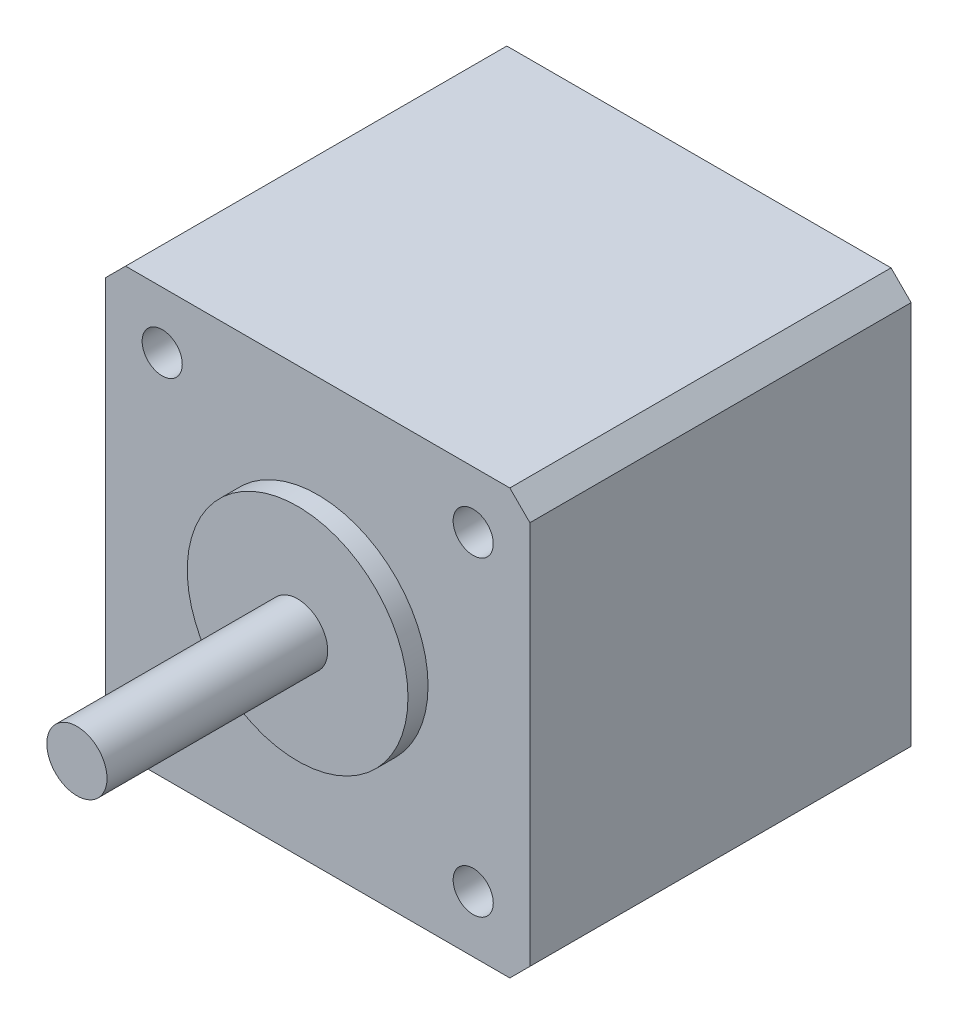
ISO-10303-21;
HEADER;
FILE_DESCRIPTION(('STEP AP214'),'2;1');
FILE_NAME('part.step','',(''),(''),'','','');
FILE_SCHEMA(('AUTOMOTIVE_DESIGN { 1 0 10303 214 1 1 1 1 }'));
ENDSEC;
DATA;
#1=APPLICATION_CONTEXT('core data for automotive mechanical design processes');
#2=APPLICATION_PROTOCOL_DEFINITION('international standard','automotive_design',2000,#1);
#3=PRODUCT_CONTEXT('',#1,'mechanical');
#4=PRODUCT('Part','Part','',(#3));
#5=PRODUCT_RELATED_PRODUCT_CATEGORY('part','',(#4));
#6=PRODUCT_DEFINITION_FORMATION('','',#4);
#7=PRODUCT_DEFINITION_CONTEXT('part definition',#1,'design');
#8=PRODUCT_DEFINITION('design','',#6,#7);
#9=PRODUCT_DEFINITION_SHAPE('','',#8);
#10=(LENGTH_UNIT() NAMED_UNIT(*) SI_UNIT(.MILLI.,.METRE.));
#11=(NAMED_UNIT(*) PLANE_ANGLE_UNIT() SI_UNIT($,.RADIAN.));
#12=(NAMED_UNIT(*) SI_UNIT($,.STERADIAN.) SOLID_ANGLE_UNIT());
#13=UNCERTAINTY_MEASURE_WITH_UNIT(LENGTH_MEASURE(1.E-05),#10,'distance_accuracy_value','');
#14=(GEOMETRIC_REPRESENTATION_CONTEXT(3) GLOBAL_UNCERTAINTY_ASSIGNED_CONTEXT((#13)) GLOBAL_UNIT_ASSIGNED_CONTEXT((#10,
#11,#12)) REPRESENTATION_CONTEXT('',''));
#15=CARTESIAN_POINT('',(0.,0.,0.));
#16=DIRECTION('',(0.,0.,1.));
#17=DIRECTION('',(1.,0.,0.));
#18=AXIS2_PLACEMENT_3D('',#15,#16,#17);
#19=CARTESIAN_POINT('',(0.,0.,38.));
#20=DIRECTION('',(0.,0.,1.));
#21=DIRECTION('',(1.,0.,0.));
#22=AXIS2_PLACEMENT_3D('',#19,#20,#21);
#23=PLANE('',#22);
#24=CARTESIAN_POINT('',(0.,0.,38.));
#25=DIRECTION('',(0.,0.,1.));
#26=DIRECTION('',(1.,0.,0.));
#27=AXIS2_PLACEMENT_3D('',#24,#25,#26);
#28=CIRCLE('',#27,11.);
#29=CARTESIAN_POINT('',(11.,0.,38.));
#30=VERTEX_POINT('',#29);
#31=EDGE_CURVE('E203',#30,#30,#28,.T.);
#32=ORIENTED_EDGE('',*,*,#31,.F.);
#33=EDGE_LOOP('',(#32));
#34=FACE_BOUND('',#33,.T.);
#35=CARTESIAN_POINT('',(15.5,-15.5,38.));
#36=DIRECTION('',(0.,0.,1.));
#37=DIRECTION('',(1.,0.,0.));
#38=AXIS2_PLACEMENT_3D('',#35,#36,#37);
#39=CIRCLE('',#38,2.);
#40=CARTESIAN_POINT('',(17.5,-15.5,38.));
#41=VERTEX_POINT('',#40);
#42=EDGE_CURVE('E188',#41,#41,#39,.T.);
#43=ORIENTED_EDGE('',*,*,#42,.F.);
#44=EDGE_LOOP('',(#43));
#45=FACE_BOUND('',#44,.T.);
#46=CARTESIAN_POINT('',(-15.5,15.5,38.));
#47=DIRECTION('',(0.,0.,1.));
#48=DIRECTION('',(1.,0.,0.));
#49=AXIS2_PLACEMENT_3D('',#46,#47,#48);
#50=CIRCLE('',#49,2.);
#51=CARTESIAN_POINT('',(-13.5,15.5,38.));
#52=VERTEX_POINT('',#51);
#53=EDGE_CURVE('E134',#52,#52,#50,.T.);
#54=ORIENTED_EDGE('',*,*,#53,.F.);
#55=EDGE_LOOP('',(#54));
#56=FACE_BOUND('',#55,.T.);
#57=DIRECTION('',(-0.707106781186548,-0.707106781186547,0.));
#58=VECTOR('',#57,1.);
#59=CARTESIAN_POINT('',(-21.15,19.15,38.));
#60=LINE('',#59,#58);
#61=CARTESIAN_POINT('',(-19.15,21.15,38.));
#62=VERTEX_POINT('',#61);
#63=CARTESIAN_POINT('',(-21.15,19.15,38.));
#64=VERTEX_POINT('',#63);
#65=EDGE_CURVE('E145',#62,#64,#60,.T.);
#66=ORIENTED_EDGE('',*,*,#65,.T.);
#67=DIRECTION('',(0.,-1.,0.));
#68=VECTOR('',#67,1.);
#69=CARTESIAN_POINT('',(-21.15,-19.15,38.));
#70=LINE('',#69,#68);
#71=CARTESIAN_POINT('',(-21.15,-19.15,38.));
#72=VERTEX_POINT('',#71);
#73=EDGE_CURVE('E93',#64,#72,#70,.T.);
#74=ORIENTED_EDGE('',*,*,#73,.T.);
#75=DIRECTION('',(0.707106781186548,-0.707106781186547,0.));
#76=VECTOR('',#75,1.);
#77=CARTESIAN_POINT('',(-19.15,-21.15,38.));
#78=LINE('',#77,#76);
#79=CARTESIAN_POINT('',(-19.15,-21.15,38.));
#80=VERTEX_POINT('',#79);
#81=EDGE_CURVE('E160',#72,#80,#78,.T.);
#82=ORIENTED_EDGE('',*,*,#81,.T.);
#83=DIRECTION('',(1.,0.,0.));
#84=VECTOR('',#83,1.);
#85=CARTESIAN_POINT('',(-19.15,-21.15,38.));
#86=LINE('',#85,#84);
#87=CARTESIAN_POINT('',(19.15,-21.15,38.));
#88=VERTEX_POINT('',#87);
#89=EDGE_CURVE('E173',#80,#88,#86,.T.);
#90=ORIENTED_EDGE('',*,*,#89,.T.);
#91=DIRECTION('',(0.707106781186548,0.707106781186547,0.));
#92=VECTOR('',#91,1.);
#93=CARTESIAN_POINT('',(19.15,-21.15,38.));
#94=LINE('',#93,#92);
#95=CARTESIAN_POINT('',(21.15,-19.15,38.));
#96=VERTEX_POINT('',#95);
#97=EDGE_CURVE('E112',#88,#96,#94,.T.);
#98=ORIENTED_EDGE('',*,*,#97,.T.);
#99=DIRECTION('',(0.,1.,0.));
#100=VECTOR('',#99,1.);
#101=CARTESIAN_POINT('',(21.15,-19.15,38.));
#102=LINE('',#101,#100);
#103=CARTESIAN_POINT('',(21.15,19.15,38.));
#104=VERTEX_POINT('',#103);
#105=EDGE_CURVE('E106',#96,#104,#102,.T.);
#106=ORIENTED_EDGE('',*,*,#105,.T.);
#107=DIRECTION('',(-0.707106781186548,0.707106781186547,0.));
#108=VECTOR('',#107,1.);
#109=CARTESIAN_POINT('',(21.15,19.15,38.));
#110=LINE('',#109,#108);
#111=CARTESIAN_POINT('',(19.15,21.15,38.));
#112=VERTEX_POINT('',#111);
#113=EDGE_CURVE('E110',#104,#112,#110,.T.);
#114=ORIENTED_EDGE('',*,*,#113,.T.);
#115=DIRECTION('',(-1.,0.,0.));
#116=VECTOR('',#115,1.);
#117=CARTESIAN_POINT('',(-19.15,21.15,38.));
#118=LINE('',#117,#116);
#119=EDGE_CURVE('E50',#112,#62,#118,.T.);
#120=ORIENTED_EDGE('',*,*,#119,.T.);
#121=EDGE_LOOP('',(#66,#74,#82,#90,#98,#106,#114,#120));
#122=FACE_BOUND('',#121,.T.);
#123=CARTESIAN_POINT('',(15.5,15.5,38.));
#124=DIRECTION('',(0.,0.,1.));
#125=DIRECTION('',(-1.,0.,0.));
#126=AXIS2_PLACEMENT_3D('',#123,#124,#125);
#127=CIRCLE('',#126,2.);
#128=CARTESIAN_POINT('',(13.5,15.5,38.));
#129=VERTEX_POINT('',#128);
#130=EDGE_CURVE('E182',#129,#129,#127,.T.);
#131=ORIENTED_EDGE('',*,*,#130,.F.);
#132=EDGE_LOOP('',(#131));
#133=FACE_BOUND('',#132,.T.);
#134=CARTESIAN_POINT('',(-15.5,-15.5,38.));
#135=DIRECTION('',(0.,0.,1.));
#136=DIRECTION('',(-1.,0.,0.));
#137=AXIS2_PLACEMENT_3D('',#134,#135,#136);
#138=CIRCLE('',#137,2.);
#139=CARTESIAN_POINT('',(-17.5,-15.5,38.));
#140=VERTEX_POINT('',#139);
#141=EDGE_CURVE('E194',#140,#140,#138,.T.);
#142=ORIENTED_EDGE('',*,*,#141,.F.);
#143=EDGE_LOOP('',(#142));
#144=FACE_BOUND('',#143,.T.);
#145=ADVANCED_FACE('F33',(#34,#45,#56,#122,#133,#144),#23,.T.);
#146=CARTESIAN_POINT('',(0.,0.,0.));
#147=DIRECTION('',(0.,0.,1.));
#148=DIRECTION('',(1.,0.,0.));
#149=AXIS2_PLACEMENT_3D('',#146,#147,#148);
#150=PLANE('',#149);
#151=DIRECTION('',(-0.707106781186548,-0.707106781186547,0.));
#152=VECTOR('',#151,1.);
#153=CARTESIAN_POINT('',(-21.15,19.15,0.));
#154=LINE('',#153,#152);
#155=CARTESIAN_POINT('',(-19.15,21.15,0.));
#156=VERTEX_POINT('',#155);
#157=CARTESIAN_POINT('',(-21.15,19.15,0.));
#158=VERTEX_POINT('',#157);
#159=EDGE_CURVE('E130',#156,#158,#154,.T.);
#160=ORIENTED_EDGE('',*,*,#159,.F.);
#161=DIRECTION('',(-1.,0.,0.));
#162=VECTOR('',#161,1.);
#163=CARTESIAN_POINT('',(-19.15,21.15,0.));
#164=LINE('',#163,#162);
#165=CARTESIAN_POINT('',(19.15,21.15,0.));
#166=VERTEX_POINT('',#165);
#167=EDGE_CURVE('E85',#166,#156,#164,.T.);
#168=ORIENTED_EDGE('',*,*,#167,.F.);
#169=DIRECTION('',(-0.707106781186548,0.707106781186547,0.));
#170=VECTOR('',#169,1.);
#171=CARTESIAN_POINT('',(21.15,19.15,0.));
#172=LINE('',#171,#170);
#173=CARTESIAN_POINT('',(21.15,19.15,0.));
#174=VERTEX_POINT('',#173);
#175=EDGE_CURVE('E79',#174,#166,#172,.T.);
#176=ORIENTED_EDGE('',*,*,#175,.F.);
#177=DIRECTION('',(0.,1.,0.));
#178=VECTOR('',#177,1.);
#179=CARTESIAN_POINT('',(21.15,-19.15,0.));
#180=LINE('',#179,#178);
#181=CARTESIAN_POINT('',(21.15,-19.15,0.));
#182=VERTEX_POINT('',#181);
#183=EDGE_CURVE('E120',#182,#174,#180,.T.);
#184=ORIENTED_EDGE('',*,*,#183,.F.);
#185=DIRECTION('',(0.707106781186548,0.707106781186547,0.));
#186=VECTOR('',#185,1.);
#187=CARTESIAN_POINT('',(19.15,-21.15,0.));
#188=LINE('',#187,#186);
#189=CARTESIAN_POINT('',(19.15,-21.15,0.));
#190=VERTEX_POINT('',#189);
#191=EDGE_CURVE('E140',#190,#182,#188,.T.);
#192=ORIENTED_EDGE('',*,*,#191,.F.);
#193=DIRECTION('',(1.,0.,0.));
#194=VECTOR('',#193,1.);
#195=CARTESIAN_POINT('',(-19.15,-21.15,0.));
#196=LINE('',#195,#194);
#197=CARTESIAN_POINT('',(-19.15,-21.15,0.));
#198=VERTEX_POINT('',#197);
#199=EDGE_CURVE('E138',#198,#190,#196,.T.);
#200=ORIENTED_EDGE('',*,*,#199,.F.);
#201=DIRECTION('',(0.707106781186548,-0.707106781186547,0.));
#202=VECTOR('',#201,1.);
#203=CARTESIAN_POINT('',(-19.15,-21.15,0.));
#204=LINE('',#203,#202);
#205=CARTESIAN_POINT('',(-21.15,-19.15,0.));
#206=VERTEX_POINT('',#205);
#207=EDGE_CURVE('E136',#206,#198,#204,.T.);
#208=ORIENTED_EDGE('',*,*,#207,.F.);
#209=DIRECTION('',(0.,-1.,0.));
#210=VECTOR('',#209,1.);
#211=CARTESIAN_POINT('',(-21.15,-19.15,0.));
#212=LINE('',#211,#210);
#213=EDGE_CURVE('E133',#158,#206,#212,.T.);
#214=ORIENTED_EDGE('',*,*,#213,.F.);
#215=EDGE_LOOP('',(#160,#168,#176,#184,#192,#200,#208,#214));
#216=FACE_BOUND('',#215,.T.);
#217=CARTESIAN_POINT('',(-15.5,15.5,0.));
#218=DIRECTION('',(0.,0.,1.));
#219=DIRECTION('',(1.,0.,0.));
#220=AXIS2_PLACEMENT_3D('',#217,#218,#219);
#221=CIRCLE('',#220,2.);
#222=CARTESIAN_POINT('',(-13.5,15.5,0.));
#223=VERTEX_POINT('',#222);
#224=EDGE_CURVE('E179',#223,#223,#221,.T.);
#225=ORIENTED_EDGE('',*,*,#224,.T.);
#226=EDGE_LOOP('',(#225));
#227=FACE_BOUND('',#226,.T.);
#228=CARTESIAN_POINT('',(15.5,15.5,0.));
#229=DIRECTION('',(0.,0.,1.));
#230=DIRECTION('',(-1.,0.,0.));
#231=AXIS2_PLACEMENT_3D('',#228,#229,#230);
#232=CIRCLE('',#231,2.);
#233=CARTESIAN_POINT('',(13.5,15.5,0.));
#234=VERTEX_POINT('',#233);
#235=EDGE_CURVE('E185',#234,#234,#232,.T.);
#236=ORIENTED_EDGE('',*,*,#235,.T.);
#237=EDGE_LOOP('',(#236));
#238=FACE_BOUND('',#237,.T.);
#239=CARTESIAN_POINT('',(15.5,-15.5,0.));
#240=DIRECTION('',(0.,0.,1.));
#241=DIRECTION('',(1.,0.,0.));
#242=AXIS2_PLACEMENT_3D('',#239,#240,#241);
#243=CIRCLE('',#242,2.);
#244=CARTESIAN_POINT('',(17.5,-15.5,0.));
#245=VERTEX_POINT('',#244);
#246=EDGE_CURVE('E191',#245,#245,#243,.T.);
#247=ORIENTED_EDGE('',*,*,#246,.T.);
#248=EDGE_LOOP('',(#247));
#249=FACE_BOUND('',#248,.T.);
#250=CARTESIAN_POINT('',(-15.5,-15.5,0.));
#251=DIRECTION('',(0.,0.,1.));
#252=DIRECTION('',(-1.,0.,0.));
#253=AXIS2_PLACEMENT_3D('',#250,#251,#252);
#254=CIRCLE('',#253,2.);
#255=CARTESIAN_POINT('',(-17.5,-15.5,0.));
#256=VERTEX_POINT('',#255);
#257=EDGE_CURVE('E197',#256,#256,#254,.T.);
#258=ORIENTED_EDGE('',*,*,#257,.T.);
#259=EDGE_LOOP('',(#258));
#260=FACE_BOUND('',#259,.T.);
#261=ADVANCED_FACE('F164',(#216,#227,#238,#249,#260),#150,.F.);
#262=CARTESIAN_POINT('',(-21.15,19.15,38.));
#263=DIRECTION('',(0.707106781186547,-0.707106781186548,0.));
#264=DIRECTION('',(0.707106781186548,0.707106781186547,0.));
#265=AXIS2_PLACEMENT_3D('',#262,#263,#264);
#266=PLANE('',#265);
#267=ORIENTED_EDGE('',*,*,#159,.T.);
#268=DIRECTION('',(0.,0.,-1.));
#269=VECTOR('',#268,1.);
#270=CARTESIAN_POINT('',(-21.15,19.15,38.));
#271=LINE('',#270,#269);
#272=EDGE_CURVE('E11',#64,#158,#271,.T.);
#273=ORIENTED_EDGE('',*,*,#272,.F.);
#274=ORIENTED_EDGE('',*,*,#65,.F.);
#275=DIRECTION('',(0.,0.,-1.));
#276=VECTOR('',#275,1.);
#277=CARTESIAN_POINT('',(-19.15,21.15,38.));
#278=LINE('',#277,#276);
#279=EDGE_CURVE('E126',#62,#156,#278,.T.);
#280=ORIENTED_EDGE('',*,*,#279,.T.);
#281=EDGE_LOOP('',(#267,#273,#274,#280));
#282=FACE_BOUND('',#281,.T.);
#283=ADVANCED_FACE('F35',(#282),#266,.F.);
#284=CARTESIAN_POINT('',(-21.15,-19.15,38.));
#285=DIRECTION('',(1.,0.,0.));
#286=DIRECTION('',(0.,0.,-1.));
#287=AXIS2_PLACEMENT_3D('',#284,#285,#286);
#288=PLANE('',#287);
#289=ORIENTED_EDGE('',*,*,#213,.T.);
#290=DIRECTION('',(0.,0.,-1.));
#291=VECTOR('',#290,1.);
#292=CARTESIAN_POINT('',(-21.15,-19.15,38.));
#293=LINE('',#292,#291);
#294=EDGE_CURVE('E42',#72,#206,#293,.T.);
#295=ORIENTED_EDGE('',*,*,#294,.F.);
#296=ORIENTED_EDGE('',*,*,#73,.F.);
#297=ORIENTED_EDGE('',*,*,#272,.T.);
#298=EDGE_LOOP('',(#289,#295,#296,#297));
#299=FACE_BOUND('',#298,.T.);
#300=ADVANCED_FACE('F283',(#299),#288,.F.);
#301=CARTESIAN_POINT('',(-19.15,-21.15,38.));
#302=DIRECTION('',(0.707106781186547,0.707106781186548,0.));
#303=DIRECTION('',(-0.707106781186548,0.707106781186547,0.));
#304=AXIS2_PLACEMENT_3D('',#301,#302,#303);
#305=PLANE('',#304);
#306=ORIENTED_EDGE('',*,*,#207,.T.);
#307=DIRECTION('',(0.,0.,-1.));
#308=VECTOR('',#307,1.);
#309=CARTESIAN_POINT('',(-19.15,-21.15,38.));
#310=LINE('',#309,#308);
#311=EDGE_CURVE('E152',#80,#198,#310,.T.);
#312=ORIENTED_EDGE('',*,*,#311,.F.);
#313=ORIENTED_EDGE('',*,*,#81,.F.);
#314=ORIENTED_EDGE('',*,*,#294,.T.);
#315=EDGE_LOOP('',(#306,#312,#313,#314));
#316=FACE_BOUND('',#315,.T.);
#317=ADVANCED_FACE('F158',(#316),#305,.F.);
#318=CARTESIAN_POINT('',(-19.15,-21.15,38.));
#319=DIRECTION('',(0.,1.,0.));
#320=DIRECTION('',(0.,0.,1.));
#321=AXIS2_PLACEMENT_3D('',#318,#319,#320);
#322=PLANE('',#321);
#323=ORIENTED_EDGE('',*,*,#199,.T.);
#324=DIRECTION('',(0.,0.,-1.));
#325=VECTOR('',#324,1.);
#326=CARTESIAN_POINT('',(19.15,-21.15,38.));
#327=LINE('',#326,#325);
#328=EDGE_CURVE('E149',#88,#190,#327,.T.);
#329=ORIENTED_EDGE('',*,*,#328,.F.);
#330=ORIENTED_EDGE('',*,*,#89,.F.);
#331=ORIENTED_EDGE('',*,*,#311,.T.);
#332=EDGE_LOOP('',(#323,#329,#330,#331));
#333=FACE_BOUND('',#332,.T.);
#334=ADVANCED_FACE('F169',(#333),#322,.F.);
#335=CARTESIAN_POINT('',(19.15,-21.15,38.));
#336=DIRECTION('',(-0.707106781186547,0.707106781186548,0.));
#337=DIRECTION('',(-0.707106781186548,-0.707106781186547,0.));
#338=AXIS2_PLACEMENT_3D('',#335,#336,#337);
#339=PLANE('',#338);
#340=ORIENTED_EDGE('',*,*,#191,.T.);
#341=DIRECTION('',(0.,0.,-1.));
#342=VECTOR('',#341,1.);
#343=CARTESIAN_POINT('',(21.15,-19.15,38.));
#344=LINE('',#343,#342);
#345=EDGE_CURVE('E121',#96,#182,#344,.T.);
#346=ORIENTED_EDGE('',*,*,#345,.F.);
#347=ORIENTED_EDGE('',*,*,#97,.F.);
#348=ORIENTED_EDGE('',*,*,#328,.T.);
#349=EDGE_LOOP('',(#340,#346,#347,#348));
#350=FACE_BOUND('',#349,.T.);
#351=ADVANCED_FACE('F172',(#350),#339,.F.);
#352=CARTESIAN_POINT('',(21.15,-19.15,38.));
#353=DIRECTION('',(-1.,0.,0.));
#354=DIRECTION('',(0.,0.,1.));
#355=AXIS2_PLACEMENT_3D('',#352,#353,#354);
#356=PLANE('',#355);
#357=ORIENTED_EDGE('',*,*,#183,.T.);
#358=DIRECTION('',(0.,0.,-1.));
#359=VECTOR('',#358,1.);
#360=CARTESIAN_POINT('',(21.15,19.15,38.));
#361=LINE('',#360,#359);
#362=EDGE_CURVE('E117',#104,#174,#361,.T.);
#363=ORIENTED_EDGE('',*,*,#362,.F.);
#364=ORIENTED_EDGE('',*,*,#105,.F.);
#365=ORIENTED_EDGE('',*,*,#345,.T.);
#366=EDGE_LOOP('',(#357,#363,#364,#365));
#367=FACE_BOUND('',#366,.T.);
#368=ADVANCED_FACE('F118',(#367),#356,.F.);
#369=CARTESIAN_POINT('',(21.15,19.15,38.));
#370=DIRECTION('',(-0.707106781186547,-0.707106781186548,0.));
#371=DIRECTION('',(0.707106781186548,-0.707106781186547,0.));
#372=AXIS2_PLACEMENT_3D('',#369,#370,#371);
#373=PLANE('',#372);
#374=ORIENTED_EDGE('',*,*,#175,.T.);
#375=DIRECTION('',(0.,0.,-1.));
#376=VECTOR('',#375,1.);
#377=CARTESIAN_POINT('',(19.15,21.15,38.));
#378=LINE('',#377,#376);
#379=EDGE_CURVE('E122',#112,#166,#378,.T.);
#380=ORIENTED_EDGE('',*,*,#379,.F.);
#381=ORIENTED_EDGE('',*,*,#113,.F.);
#382=ORIENTED_EDGE('',*,*,#362,.T.);
#383=EDGE_LOOP('',(#374,#380,#381,#382));
#384=FACE_BOUND('',#383,.T.);
#385=ADVANCED_FACE('F124',(#384),#373,.F.);
#386=CARTESIAN_POINT('',(-19.15,21.15,38.));
#387=DIRECTION('',(0.,-1.,0.));
#388=DIRECTION('',(0.,0.,-1.));
#389=AXIS2_PLACEMENT_3D('',#386,#387,#388);
#390=PLANE('',#389);
#391=ORIENTED_EDGE('',*,*,#167,.T.);
#392=ORIENTED_EDGE('',*,*,#279,.F.);
#393=ORIENTED_EDGE('',*,*,#119,.F.);
#394=ORIENTED_EDGE('',*,*,#379,.T.);
#395=EDGE_LOOP('',(#391,#392,#393,#394));
#396=FACE_BOUND('',#395,.T.);
#397=ADVANCED_FACE('F247',(#396),#390,.F.);
#398=CARTESIAN_POINT('',(-15.5,15.5,38.));
#399=DIRECTION('',(0.,0.,-1.));
#400=DIRECTION('',(-1.,0.,0.));
#401=AXIS2_PLACEMENT_3D('',#398,#399,#400);
#402=CYLINDRICAL_SURFACE('',#401,2.);
#403=ORIENTED_EDGE('',*,*,#53,.T.);
#404=EDGE_LOOP('',(#403));
#405=FACE_BOUND('',#404,.T.);
#406=ORIENTED_EDGE('',*,*,#224,.F.);
#407=EDGE_LOOP('',(#406));
#408=FACE_BOUND('',#407,.T.);
#409=ADVANCED_FACE('F243',(#405,#408),#402,.F.);
#410=CARTESIAN_POINT('',(15.5,15.5,38.));
#411=DIRECTION('',(0.,0.,-1.));
#412=DIRECTION('',(-1.,0.,0.));
#413=AXIS2_PLACEMENT_3D('',#410,#411,#412);
#414=CYLINDRICAL_SURFACE('',#413,2.);
#415=ORIENTED_EDGE('',*,*,#130,.T.);
#416=EDGE_LOOP('',(#415));
#417=FACE_BOUND('',#416,.T.);
#418=ORIENTED_EDGE('',*,*,#235,.F.);
#419=EDGE_LOOP('',(#418));
#420=FACE_BOUND('',#419,.T.);
#421=ADVANCED_FACE('F246',(#417,#420),#414,.F.);
#422=CARTESIAN_POINT('',(15.5,-15.5,38.));
#423=DIRECTION('',(0.,0.,-1.));
#424=DIRECTION('',(-1.,0.,0.));
#425=AXIS2_PLACEMENT_3D('',#422,#423,#424);
#426=CYLINDRICAL_SURFACE('',#425,2.);
#427=ORIENTED_EDGE('',*,*,#42,.T.);
#428=EDGE_LOOP('',(#427));
#429=FACE_BOUND('',#428,.T.);
#430=ORIENTED_EDGE('',*,*,#246,.F.);
#431=EDGE_LOOP('',(#430));
#432=FACE_BOUND('',#431,.T.);
#433=ADVANCED_FACE('F260',(#429,#432),#426,.F.);
#434=CARTESIAN_POINT('',(-15.5,-15.5,38.));
#435=DIRECTION('',(0.,0.,-1.));
#436=DIRECTION('',(-1.,0.,0.));
#437=AXIS2_PLACEMENT_3D('',#434,#435,#436);
#438=CYLINDRICAL_SURFACE('',#437,2.);
#439=ORIENTED_EDGE('',*,*,#141,.T.);
#440=EDGE_LOOP('',(#439));
#441=FACE_BOUND('',#440,.T.);
#442=ORIENTED_EDGE('',*,*,#257,.F.);
#443=EDGE_LOOP('',(#442));
#444=FACE_BOUND('',#443,.T.);
#445=ADVANCED_FACE('F232',(#441,#444),#438,.F.);
#446=CARTESIAN_POINT('',(0.,0.,40.));
#447=DIRECTION('',(0.,0.,-1.));
#448=DIRECTION('',(-1.,0.,0.));
#449=AXIS2_PLACEMENT_3D('',#446,#447,#448);
#450=CYLINDRICAL_SURFACE('',#449,11.);
#451=CARTESIAN_POINT('',(0.,0.,40.));
#452=DIRECTION('',(0.,0.,1.));
#453=DIRECTION('',(1.,0.,0.));
#454=AXIS2_PLACEMENT_3D('',#451,#452,#453);
#455=CIRCLE('',#454,11.);
#456=CARTESIAN_POINT('',(11.,0.,40.));
#457=VERTEX_POINT('',#456);
#458=EDGE_CURVE('E200',#457,#457,#455,.T.);
#459=ORIENTED_EDGE('',*,*,#458,.F.);
#460=EDGE_LOOP('',(#459));
#461=FACE_BOUND('',#460,.T.);
#462=ORIENTED_EDGE('',*,*,#31,.T.);
#463=EDGE_LOOP('',(#462));
#464=FACE_BOUND('',#463,.T.);
#465=ADVANCED_FACE('F226',(#461,#464),#450,.T.);
#466=CARTESIAN_POINT('',(0.,0.,40.));
#467=DIRECTION('',(0.,0.,1.));
#468=DIRECTION('',(1.,0.,0.));
#469=AXIS2_PLACEMENT_3D('',#466,#467,#468);
#470=PLANE('',#469);
#471=CARTESIAN_POINT('',(0.,0.,40.));
#472=DIRECTION('',(0.,0.,1.));
#473=DIRECTION('',(1.,0.,0.));
#474=AXIS2_PLACEMENT_3D('',#471,#472,#473);
#475=CIRCLE('',#474,3.);
#476=CARTESIAN_POINT('',(3.,0.,40.));
#477=VERTEX_POINT('',#476);
#478=EDGE_CURVE('E209',#477,#477,#475,.T.);
#479=ORIENTED_EDGE('',*,*,#478,.F.);
#480=EDGE_LOOP('',(#479));
#481=FACE_BOUND('',#480,.T.);
#482=ORIENTED_EDGE('',*,*,#458,.T.);
#483=EDGE_LOOP('',(#482));
#484=FACE_BOUND('',#483,.T.);
#485=ADVANCED_FACE('F220',(#481,#484),#470,.T.);
#486=CARTESIAN_POINT('',(0.,0.,62.));
#487=DIRECTION('',(0.,0.,-1.));
#488=DIRECTION('',(-1.,0.,0.));
#489=AXIS2_PLACEMENT_3D('',#486,#487,#488);
#490=CYLINDRICAL_SURFACE('',#489,3.);
#491=CARTESIAN_POINT('',(0.,0.,62.));
#492=DIRECTION('',(0.,0.,1.));
#493=DIRECTION('',(1.,0.,0.));
#494=AXIS2_PLACEMENT_3D('',#491,#492,#493);
#495=CIRCLE('',#494,3.);
#496=CARTESIAN_POINT('',(3.,0.,62.));
#497=VERTEX_POINT('',#496);
#498=EDGE_CURVE('E206',#497,#497,#495,.T.);
#499=ORIENTED_EDGE('',*,*,#498,.F.);
#500=EDGE_LOOP('',(#499));
#501=FACE_BOUND('',#500,.T.);
#502=ORIENTED_EDGE('',*,*,#478,.T.);
#503=EDGE_LOOP('',(#502));
#504=FACE_BOUND('',#503,.T.);
#505=ADVANCED_FACE('F217',(#501,#504),#490,.T.);
#506=CARTESIAN_POINT('',(0.,0.,62.));
#507=DIRECTION('',(0.,0.,1.));
#508=DIRECTION('',(1.,0.,0.));
#509=AXIS2_PLACEMENT_3D('',#506,#507,#508);
#510=PLANE('',#509);
#511=ORIENTED_EDGE('',*,*,#498,.T.);
#512=EDGE_LOOP('',(#511));
#513=FACE_BOUND('',#512,.T.);
#514=ADVANCED_FACE('F215',(#513),#510,.T.);
#515=CLOSED_SHELL('',(#145,#261,#283,#300,#317,#334,#351,#368,#385,#397,#409,#421,#433,#445,
#465,#485,#505,#514));
#516=MANIFOLD_SOLID_BREP('B2',#515);
#517=ADVANCED_BREP_SHAPE_REPRESENTATION('',(#18,#516),#14);
#518=SHAPE_DEFINITION_REPRESENTATION(#9,#517);
ENDSEC;
END-ISO-10303-21;
